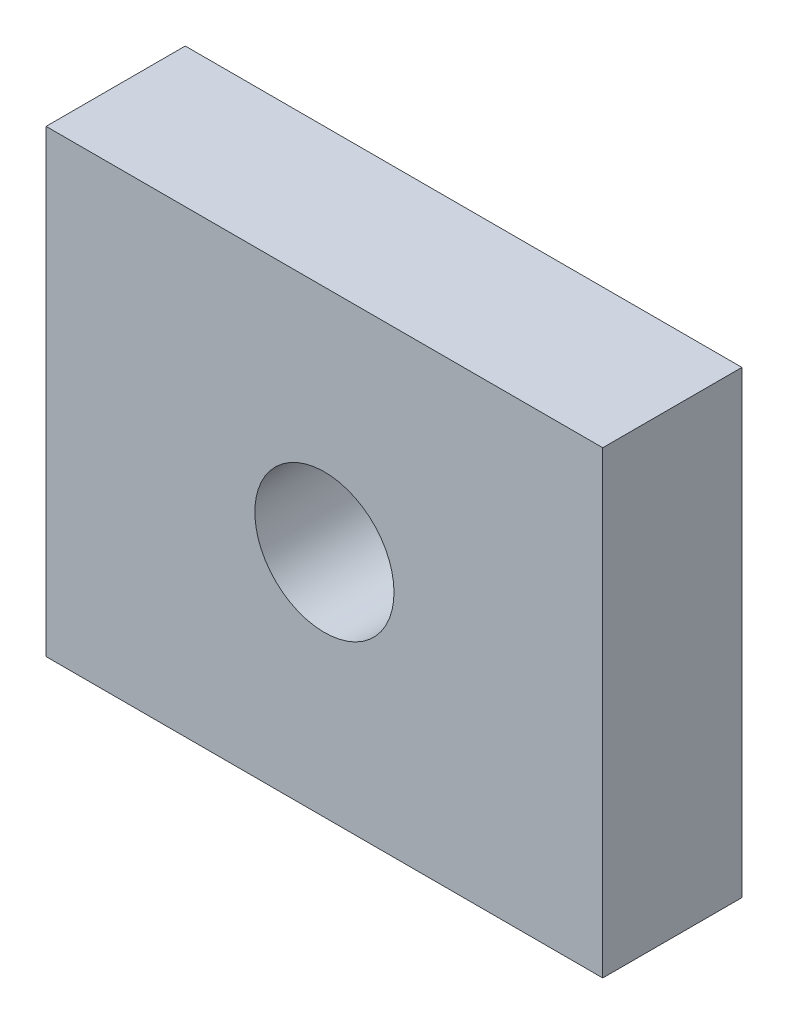
ISO-10303-21;
HEADER;
FILE_DESCRIPTION(('STEP AP214'),'2;1');
FILE_NAME('part.step','',(''),(''),'','','');
FILE_SCHEMA(('AUTOMOTIVE_DESIGN { 1 0 10303 214 1 1 1 1 }'));
ENDSEC;
DATA;
#1=APPLICATION_CONTEXT('core data for automotive mechanical design processes');
#2=APPLICATION_PROTOCOL_DEFINITION('international standard','automotive_design',2000,#1);
#3=PRODUCT_CONTEXT('',#1,'mechanical');
#4=PRODUCT('Part','Part','',(#3));
#5=PRODUCT_RELATED_PRODUCT_CATEGORY('part','',(#4));
#6=PRODUCT_DEFINITION_FORMATION('','',#4);
#7=PRODUCT_DEFINITION_CONTEXT('part definition',#1,'design');
#8=PRODUCT_DEFINITION('design','',#6,#7);
#9=PRODUCT_DEFINITION_SHAPE('','',#8);
#10=(LENGTH_UNIT() NAMED_UNIT(*) SI_UNIT(.MILLI.,.METRE.));
#11=(NAMED_UNIT(*) PLANE_ANGLE_UNIT() SI_UNIT($,.RADIAN.));
#12=(NAMED_UNIT(*) SI_UNIT($,.STERADIAN.) SOLID_ANGLE_UNIT());
#13=UNCERTAINTY_MEASURE_WITH_UNIT(LENGTH_MEASURE(1.E-05),#10,'distance_accuracy_value','');
#14=(GEOMETRIC_REPRESENTATION_CONTEXT(3) GLOBAL_UNCERTAINTY_ASSIGNED_CONTEXT((#13)) GLOBAL_UNIT_ASSIGNED_CONTEXT((#10,
#11,#12)) REPRESENTATION_CONTEXT('',''));
#15=CARTESIAN_POINT('',(0.,0.,0.));
#16=DIRECTION('',(0.,0.,1.));
#17=DIRECTION('',(1.,0.,0.));
#18=AXIS2_PLACEMENT_3D('',#15,#16,#17);
#19=CARTESIAN_POINT('',(0.,0.,5.));
#20=DIRECTION('',(0.,0.,-1.));
#21=DIRECTION('',(-1.,0.,0.));
#22=AXIS2_PLACEMENT_3D('',#19,#20,#21);
#23=PLANE('',#22);
#24=DIRECTION('',(0.,-1.,0.));
#25=VECTOR('',#24,1.);
#26=CARTESIAN_POINT('',(0.,0.,5.));
#27=LINE('',#26,#25);
#28=CARTESIAN_POINT('',(0.,16.5,5.));
#29=VERTEX_POINT('',#28);
#30=CARTESIAN_POINT('',(0.,0.,5.));
#31=VERTEX_POINT('',#30);
#32=EDGE_CURVE('E85',#29,#31,#27,.T.);
#33=ORIENTED_EDGE('',*,*,#32,.T.);
#34=DIRECTION('',(1.,0.,0.));
#35=VECTOR('',#34,1.);
#36=CARTESIAN_POINT('',(0.,0.,5.));
#37=LINE('',#36,#35);
#38=CARTESIAN_POINT('',(20.,0.,5.));
#39=VERTEX_POINT('',#38);
#40=EDGE_CURVE('E80',#31,#39,#37,.T.);
#41=ORIENTED_EDGE('',*,*,#40,.T.);
#42=DIRECTION('',(0.,1.,0.));
#43=VECTOR('',#42,1.);
#44=CARTESIAN_POINT('',(20.,0.,5.));
#45=LINE('',#44,#43);
#46=CARTESIAN_POINT('',(20.,16.5,5.));
#47=VERTEX_POINT('',#46);
#48=EDGE_CURVE('E83',#39,#47,#45,.T.);
#49=ORIENTED_EDGE('',*,*,#48,.T.);
#50=DIRECTION('',(-1.,0.,0.));
#51=VECTOR('',#50,1.);
#52=CARTESIAN_POINT('',(0.,16.5,5.));
#53=LINE('',#52,#51);
#54=EDGE_CURVE('E50',#47,#29,#53,.T.);
#55=ORIENTED_EDGE('',*,*,#54,.T.);
#56=EDGE_LOOP('',(#33,#41,#49,#55));
#57=FACE_BOUND('',#56,.T.);
#58=CARTESIAN_POINT('',(10.,8.25,5.));
#59=DIRECTION('',(0.,0.,1.));
#60=DIRECTION('',(1.,0.,0.));
#61=AXIS2_PLACEMENT_3D('',#58,#59,#60);
#62=CIRCLE('',#61,2.5);
#63=CARTESIAN_POINT('',(12.5,8.25,5.));
#64=VERTEX_POINT('',#63);
#65=EDGE_CURVE('E100',#64,#64,#62,.T.);
#66=ORIENTED_EDGE('',*,*,#65,.F.);
#67=EDGE_LOOP('',(#66));
#68=FACE_BOUND('',#67,.T.);
#69=ADVANCED_FACE('F33',(#57,#68),#23,.F.);
#70=CARTESIAN_POINT('',(0.,0.,0.));
#71=DIRECTION('',(0.,0.,-1.));
#72=DIRECTION('',(-1.,0.,0.));
#73=AXIS2_PLACEMENT_3D('',#70,#71,#72);
#74=PLANE('',#73);
#75=DIRECTION('',(0.,-1.,0.));
#76=VECTOR('',#75,1.);
#77=CARTESIAN_POINT('',(0.,0.,0.));
#78=LINE('',#77,#76);
#79=CARTESIAN_POINT('',(0.,16.5,0.));
#80=VERTEX_POINT('',#79);
#81=CARTESIAN_POINT('',(0.,0.,0.));
#82=VERTEX_POINT('',#81);
#83=EDGE_CURVE('E97',#80,#82,#78,.T.);
#84=ORIENTED_EDGE('',*,*,#83,.F.);
#85=DIRECTION('',(-1.,0.,0.));
#86=VECTOR('',#85,1.);
#87=CARTESIAN_POINT('',(0.,16.5,0.));
#88=LINE('',#87,#86);
#89=CARTESIAN_POINT('',(20.,16.5,0.));
#90=VERTEX_POINT('',#89);
#91=EDGE_CURVE('E73',#90,#80,#88,.T.);
#92=ORIENTED_EDGE('',*,*,#91,.F.);
#93=DIRECTION('',(0.,1.,0.));
#94=VECTOR('',#93,1.);
#95=CARTESIAN_POINT('',(20.,0.,0.));
#96=LINE('',#95,#94);
#97=CARTESIAN_POINT('',(20.,0.,0.));
#98=VERTEX_POINT('',#97);
#99=EDGE_CURVE('E67',#98,#90,#96,.T.);
#100=ORIENTED_EDGE('',*,*,#99,.F.);
#101=DIRECTION('',(1.,0.,0.));
#102=VECTOR('',#101,1.);
#103=CARTESIAN_POINT('',(0.,0.,0.));
#104=LINE('',#103,#102);
#105=EDGE_CURVE('E89',#82,#98,#104,.T.);
#106=ORIENTED_EDGE('',*,*,#105,.F.);
#107=EDGE_LOOP('',(#84,#92,#100,#106));
#108=FACE_BOUND('',#107,.T.);
#109=CARTESIAN_POINT('',(10.,8.25,0.));
#110=DIRECTION('',(0.,0.,1.));
#111=DIRECTION('',(1.,0.,0.));
#112=AXIS2_PLACEMENT_3D('',#109,#110,#111);
#113=CIRCLE('',#112,2.5);
#114=CARTESIAN_POINT('',(12.5,8.25,0.));
#115=VERTEX_POINT('',#114);
#116=EDGE_CURVE('E112',#115,#115,#113,.T.);
#117=ORIENTED_EDGE('',*,*,#116,.T.);
#118=EDGE_LOOP('',(#117));
#119=FACE_BOUND('',#118,.T.);
#120=ADVANCED_FACE('F108',(#108,#119),#74,.T.);
#121=CARTESIAN_POINT('',(0.,0.,5.));
#122=DIRECTION('',(1.,0.,0.));
#123=DIRECTION('',(0.,0.,-1.));
#124=AXIS2_PLACEMENT_3D('',#121,#122,#123);
#125=PLANE('',#124);
#126=ORIENTED_EDGE('',*,*,#83,.T.);
#127=DIRECTION('',(0.,0.,-1.));
#128=VECTOR('',#127,1.);
#129=CARTESIAN_POINT('',(0.,0.,5.));
#130=LINE('',#129,#128);
#131=EDGE_CURVE('E11',#31,#82,#130,.T.);
#132=ORIENTED_EDGE('',*,*,#131,.F.);
#133=ORIENTED_EDGE('',*,*,#32,.F.);
#134=DIRECTION('',(0.,0.,-1.));
#135=VECTOR('',#134,1.);
#136=CARTESIAN_POINT('',(0.,16.5,5.));
#137=LINE('',#136,#135);
#138=EDGE_CURVE('E93',#29,#80,#137,.T.);
#139=ORIENTED_EDGE('',*,*,#138,.T.);
#140=EDGE_LOOP('',(#126,#132,#133,#139));
#141=FACE_BOUND('',#140,.T.);
#142=ADVANCED_FACE('F35',(#141),#125,.F.);
#143=CARTESIAN_POINT('',(0.,0.,5.));
#144=DIRECTION('',(0.,1.,0.));
#145=DIRECTION('',(-1.,0.,0.));
#146=AXIS2_PLACEMENT_3D('',#143,#144,#145);
#147=PLANE('',#146);
#148=ORIENTED_EDGE('',*,*,#105,.T.);
#149=DIRECTION('',(0.,0.,-1.));
#150=VECTOR('',#149,1.);
#151=CARTESIAN_POINT('',(20.,0.,5.));
#152=LINE('',#151,#150);
#153=EDGE_CURVE('E42',#39,#98,#152,.T.);
#154=ORIENTED_EDGE('',*,*,#153,.F.);
#155=ORIENTED_EDGE('',*,*,#40,.F.);
#156=ORIENTED_EDGE('',*,*,#131,.T.);
#157=EDGE_LOOP('',(#148,#154,#155,#156));
#158=FACE_BOUND('',#157,.T.);
#159=ADVANCED_FACE('F88',(#158),#147,.F.);
#160=CARTESIAN_POINT('',(20.,0.,5.));
#161=DIRECTION('',(-1.,0.,0.));
#162=DIRECTION('',(0.,0.,1.));
#163=AXIS2_PLACEMENT_3D('',#160,#161,#162);
#164=PLANE('',#163);
#165=ORIENTED_EDGE('',*,*,#99,.T.);
#166=DIRECTION('',(0.,0.,-1.));
#167=VECTOR('',#166,1.);
#168=CARTESIAN_POINT('',(20.,16.5,5.));
#169=LINE('',#168,#167);
#170=EDGE_CURVE('E90',#47,#90,#169,.T.);
#171=ORIENTED_EDGE('',*,*,#170,.F.);
#172=ORIENTED_EDGE('',*,*,#48,.F.);
#173=ORIENTED_EDGE('',*,*,#153,.T.);
#174=EDGE_LOOP('',(#165,#171,#172,#173));
#175=FACE_BOUND('',#174,.T.);
#176=ADVANCED_FACE('F91',(#175),#164,.F.);
#177=CARTESIAN_POINT('',(0.,16.5,5.));
#178=DIRECTION('',(0.,-1.,0.));
#179=DIRECTION('',(0.,0.,-1.));
#180=AXIS2_PLACEMENT_3D('',#177,#178,#179);
#181=PLANE('',#180);
#182=ORIENTED_EDGE('',*,*,#91,.T.);
#183=ORIENTED_EDGE('',*,*,#138,.F.);
#184=ORIENTED_EDGE('',*,*,#54,.F.);
#185=ORIENTED_EDGE('',*,*,#170,.T.);
#186=EDGE_LOOP('',(#182,#183,#184,#185));
#187=FACE_BOUND('',#186,.T.);
#188=ADVANCED_FACE('F105',(#187),#181,.F.);
#189=CARTESIAN_POINT('',(10.,8.25,5.));
#190=DIRECTION('',(0.,0.,-1.));
#191=DIRECTION('',(-1.,0.,0.));
#192=AXIS2_PLACEMENT_3D('',#189,#190,#191);
#193=CYLINDRICAL_SURFACE('',#192,2.5);
#194=ORIENTED_EDGE('',*,*,#65,.T.);
#195=EDGE_LOOP('',(#194));
#196=FACE_BOUND('',#195,.T.);
#197=ORIENTED_EDGE('',*,*,#116,.F.);
#198=EDGE_LOOP('',(#197));
#199=FACE_BOUND('',#198,.T.);
#200=ADVANCED_FACE('F118',(#196,#199),#193,.F.);
#201=CLOSED_SHELL('',(#69,#120,#142,#159,#176,#188,#200));
#202=MANIFOLD_SOLID_BREP('B2',#201);
#203=ADVANCED_BREP_SHAPE_REPRESENTATION('',(#18,#202),#14);
#204=SHAPE_DEFINITION_REPRESENTATION(#9,#203);
ENDSEC;
END-ISO-10303-21;
